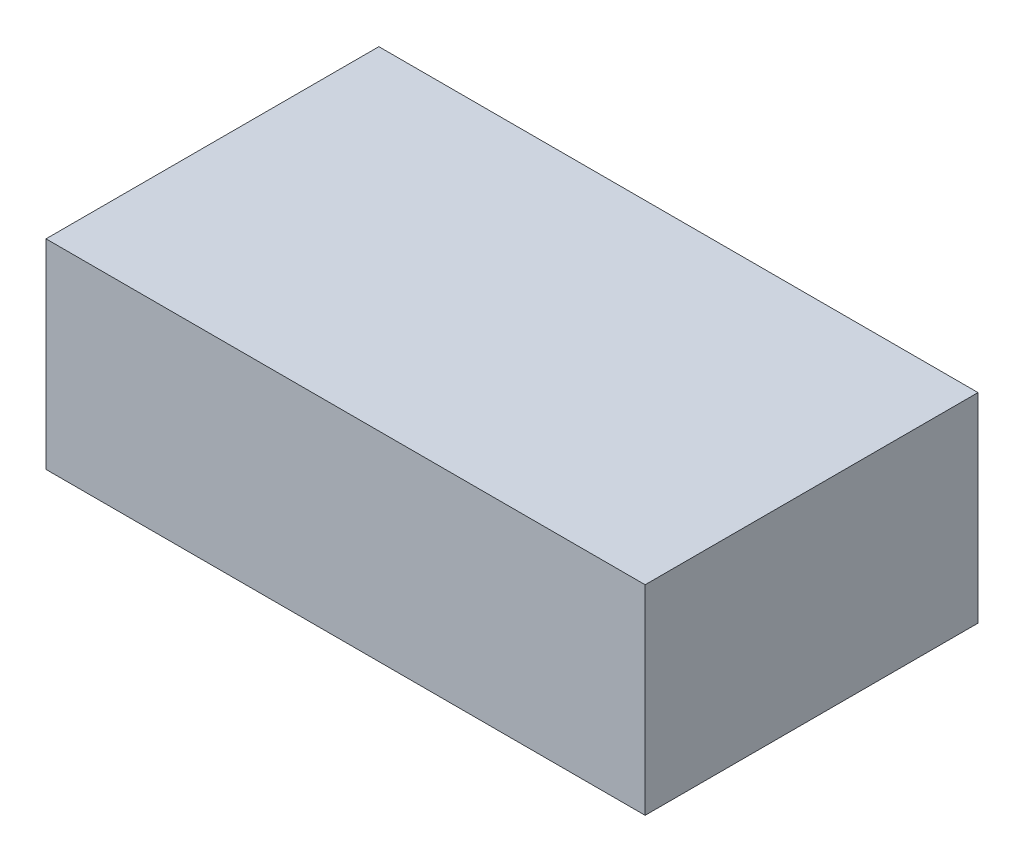
ISO-10303-21;
HEADER;
FILE_DESCRIPTION(('STEP AP214'),'2;1');
FILE_NAME('part.step','',(''),(''),'','','');
FILE_SCHEMA(('AUTOMOTIVE_DESIGN { 1 0 10303 214 1 1 1 1 }'));
ENDSEC;
DATA;
#1=APPLICATION_CONTEXT('core data for automotive mechanical design processes');
#2=APPLICATION_PROTOCOL_DEFINITION('international standard','automotive_design',2000,#1);
#3=PRODUCT_CONTEXT('',#1,'mechanical');
#4=PRODUCT('Part','Part','',(#3));
#5=PRODUCT_RELATED_PRODUCT_CATEGORY('part','',(#4));
#6=PRODUCT_DEFINITION_FORMATION('','',#4);
#7=PRODUCT_DEFINITION_CONTEXT('part definition',#1,'design');
#8=PRODUCT_DEFINITION('design','',#6,#7);
#9=PRODUCT_DEFINITION_SHAPE('','',#8);
#10=(LENGTH_UNIT() NAMED_UNIT(*) SI_UNIT(.MILLI.,.METRE.));
#11=(NAMED_UNIT(*) PLANE_ANGLE_UNIT() SI_UNIT($,.RADIAN.));
#12=(NAMED_UNIT(*) SI_UNIT($,.STERADIAN.) SOLID_ANGLE_UNIT());
#13=UNCERTAINTY_MEASURE_WITH_UNIT(LENGTH_MEASURE(1.E-05),#10,'distance_accuracy_value','');
#14=(GEOMETRIC_REPRESENTATION_CONTEXT(3) GLOBAL_UNCERTAINTY_ASSIGNED_CONTEXT((#13)) GLOBAL_UNIT_ASSIGNED_CONTEXT((#10,
#11,#12)) REPRESENTATION_CONTEXT('',''));
#15=CARTESIAN_POINT('',(0.,0.,0.));
#16=DIRECTION('',(0.,0.,1.));
#17=DIRECTION('',(1.,0.,0.));
#18=AXIS2_PLACEMENT_3D('',#15,#16,#17);
#19=CARTESIAN_POINT('',(13.5,-4.5,15.));
#20=DIRECTION('',(-1.,0.,0.));
#21=DIRECTION('',(0.,0.,1.));
#22=AXIS2_PLACEMENT_3D('',#19,#20,#21);
#23=PLANE('',#22);
#24=DIRECTION('',(0.,1.,0.));
#25=VECTOR('',#24,1.);
#26=CARTESIAN_POINT('',(13.5,-4.5,0.));
#27=LINE('',#26,#25);
#28=CARTESIAN_POINT('',(13.5,-4.5,0.));
#29=VERTEX_POINT('',#28);
#30=CARTESIAN_POINT('',(13.5,4.5,0.));
#31=VERTEX_POINT('',#30);
#32=EDGE_CURVE('E106',#29,#31,#27,.T.);
#33=ORIENTED_EDGE('',*,*,#32,.T.);
#34=DIRECTION('',(0.,0.,-1.));
#35=VECTOR('',#34,1.);
#36=CARTESIAN_POINT('',(13.5,4.5,15.));
#37=LINE('',#36,#35);
#38=CARTESIAN_POINT('',(13.5,4.5,15.));
#39=VERTEX_POINT('',#38);
#40=EDGE_CURVE('E11',#39,#31,#37,.T.);
#41=ORIENTED_EDGE('',*,*,#40,.F.);
#42=DIRECTION('',(0.,1.,0.));
#43=VECTOR('',#42,1.);
#44=CARTESIAN_POINT('',(13.5,-4.5,15.));
#45=LINE('',#44,#43);
#46=CARTESIAN_POINT('',(13.5,-4.5,15.));
#47=VERTEX_POINT('',#46);
#48=EDGE_CURVE('E89',#47,#39,#45,.T.);
#49=ORIENTED_EDGE('',*,*,#48,.F.);
#50=DIRECTION('',(0.,0.,-1.));
#51=VECTOR('',#50,1.);
#52=CARTESIAN_POINT('',(13.5,-4.5,15.));
#53=LINE('',#52,#51);
#54=EDGE_CURVE('E102',#47,#29,#53,.T.);
#55=ORIENTED_EDGE('',*,*,#54,.T.);
#56=EDGE_LOOP('',(#33,#41,#49,#55));
#57=FACE_BOUND('',#56,.T.);
#58=ADVANCED_FACE('F37',(#57),#23,.F.);
#59=CARTESIAN_POINT('',(-13.5,4.5,15.));
#60=DIRECTION('',(0.,-1.,0.));
#61=DIRECTION('',(0.,0.,-1.));
#62=AXIS2_PLACEMENT_3D('',#59,#60,#61);
#63=PLANE('',#62);
#64=DIRECTION('',(-1.,0.,0.));
#65=VECTOR('',#64,1.);
#66=CARTESIAN_POINT('',(-13.5,4.5,0.));
#67=LINE('',#66,#65);
#68=CARTESIAN_POINT('',(-13.5,4.5,0.));
#69=VERTEX_POINT('',#68);
#70=EDGE_CURVE('E94',#31,#69,#67,.T.);
#71=ORIENTED_EDGE('',*,*,#70,.T.);
#72=DIRECTION('',(0.,0.,-1.));
#73=VECTOR('',#72,1.);
#74=CARTESIAN_POINT('',(-13.5,4.5,15.));
#75=LINE('',#74,#73);
#76=CARTESIAN_POINT('',(-13.5,4.5,15.));
#77=VERTEX_POINT('',#76);
#78=EDGE_CURVE('E46',#77,#69,#75,.T.);
#79=ORIENTED_EDGE('',*,*,#78,.F.);
#80=DIRECTION('',(-1.,0.,0.));
#81=VECTOR('',#80,1.);
#82=CARTESIAN_POINT('',(-13.5,4.5,15.));
#83=LINE('',#82,#81);
#84=EDGE_CURVE('E84',#39,#77,#83,.T.);
#85=ORIENTED_EDGE('',*,*,#84,.F.);
#86=ORIENTED_EDGE('',*,*,#40,.T.);
#87=EDGE_LOOP('',(#71,#79,#85,#86));
#88=FACE_BOUND('',#87,.T.);
#89=ADVANCED_FACE('F93',(#88),#63,.F.);
#90=CARTESIAN_POINT('',(-13.5,-4.5,15.));
#91=DIRECTION('',(1.,0.,0.));
#92=DIRECTION('',(0.,0.,-1.));
#93=AXIS2_PLACEMENT_3D('',#90,#91,#92);
#94=PLANE('',#93);
#95=DIRECTION('',(0.,-1.,0.));
#96=VECTOR('',#95,1.);
#97=CARTESIAN_POINT('',(-13.5,-4.5,0.));
#98=LINE('',#97,#96);
#99=CARTESIAN_POINT('',(-13.5,-4.5,0.));
#100=VERTEX_POINT('',#99);
#101=EDGE_CURVE('E71',#69,#100,#98,.T.);
#102=ORIENTED_EDGE('',*,*,#101,.T.);
#103=DIRECTION('',(0.,0.,-1.));
#104=VECTOR('',#103,1.);
#105=CARTESIAN_POINT('',(-13.5,-4.5,15.));
#106=LINE('',#105,#104);
#107=CARTESIAN_POINT('',(-13.5,-4.5,15.));
#108=VERTEX_POINT('',#107);
#109=EDGE_CURVE('E96',#108,#100,#106,.T.);
#110=ORIENTED_EDGE('',*,*,#109,.F.);
#111=DIRECTION('',(0.,-1.,0.));
#112=VECTOR('',#111,1.);
#113=CARTESIAN_POINT('',(-13.5,-4.5,15.));
#114=LINE('',#113,#112);
#115=EDGE_CURVE('E87',#77,#108,#114,.T.);
#116=ORIENTED_EDGE('',*,*,#115,.F.);
#117=ORIENTED_EDGE('',*,*,#78,.T.);
#118=EDGE_LOOP('',(#102,#110,#116,#117));
#119=FACE_BOUND('',#118,.T.);
#120=ADVANCED_FACE('F97',(#119),#94,.F.);
#121=CARTESIAN_POINT('',(-13.5,-4.5,15.));
#122=DIRECTION('',(0.,1.,0.));
#123=DIRECTION('',(0.,0.,1.));
#124=AXIS2_PLACEMENT_3D('',#121,#122,#123);
#125=PLANE('',#124);
#126=DIRECTION('',(1.,0.,0.));
#127=VECTOR('',#126,1.);
#128=CARTESIAN_POINT('',(-13.5,-4.5,0.));
#129=LINE('',#128,#127);
#130=EDGE_CURVE('E77',#100,#29,#129,.T.);
#131=ORIENTED_EDGE('',*,*,#130,.T.);
#132=ORIENTED_EDGE('',*,*,#54,.F.);
#133=DIRECTION('',(1.,0.,0.));
#134=VECTOR('',#133,1.);
#135=CARTESIAN_POINT('',(-13.5,-4.5,15.));
#136=LINE('',#135,#134);
#137=EDGE_CURVE('E54',#108,#47,#136,.T.);
#138=ORIENTED_EDGE('',*,*,#137,.F.);
#139=ORIENTED_EDGE('',*,*,#109,.T.);
#140=EDGE_LOOP('',(#131,#132,#138,#139));
#141=FACE_BOUND('',#140,.T.);
#142=ADVANCED_FACE('F118',(#141),#125,.F.);
#143=CARTESIAN_POINT('',(0.,0.,15.));
#144=DIRECTION('',(0.,0.,-1.));
#145=DIRECTION('',(-1.,0.,0.));
#146=AXIS2_PLACEMENT_3D('',#143,#144,#145);
#147=PLANE('',#146);
#148=ORIENTED_EDGE('',*,*,#48,.T.);
#149=ORIENTED_EDGE('',*,*,#84,.T.);
#150=ORIENTED_EDGE('',*,*,#115,.T.);
#151=ORIENTED_EDGE('',*,*,#137,.T.);
#152=EDGE_LOOP('',(#148,#149,#150,#151));
#153=FACE_BOUND('',#152,.T.);
#154=ADVANCED_FACE('F85',(#153),#147,.F.);
#155=CARTESIAN_POINT('',(0.,0.,0.));
#156=DIRECTION('',(0.,0.,-1.));
#157=DIRECTION('',(-1.,0.,0.));
#158=AXIS2_PLACEMENT_3D('',#155,#156,#157);
#159=PLANE('',#158);
#160=ORIENTED_EDGE('',*,*,#32,.F.);
#161=ORIENTED_EDGE('',*,*,#130,.F.);
#162=ORIENTED_EDGE('',*,*,#101,.F.);
#163=ORIENTED_EDGE('',*,*,#70,.F.);
#164=EDGE_LOOP('',(#160,#161,#162,#163));
#165=FACE_BOUND('',#164,.T.);
#166=ADVANCED_FACE('F121',(#165),#159,.T.);
#167=CLOSED_SHELL('',(#58,#89,#120,#142,#154,#166));
#168=MANIFOLD_SOLID_BREP('B2',#167);
#169=ADVANCED_BREP_SHAPE_REPRESENTATION('',(#18,#168),#14);
#170=SHAPE_DEFINITION_REPRESENTATION(#9,#169);
ENDSEC;
END-ISO-10303-21;
